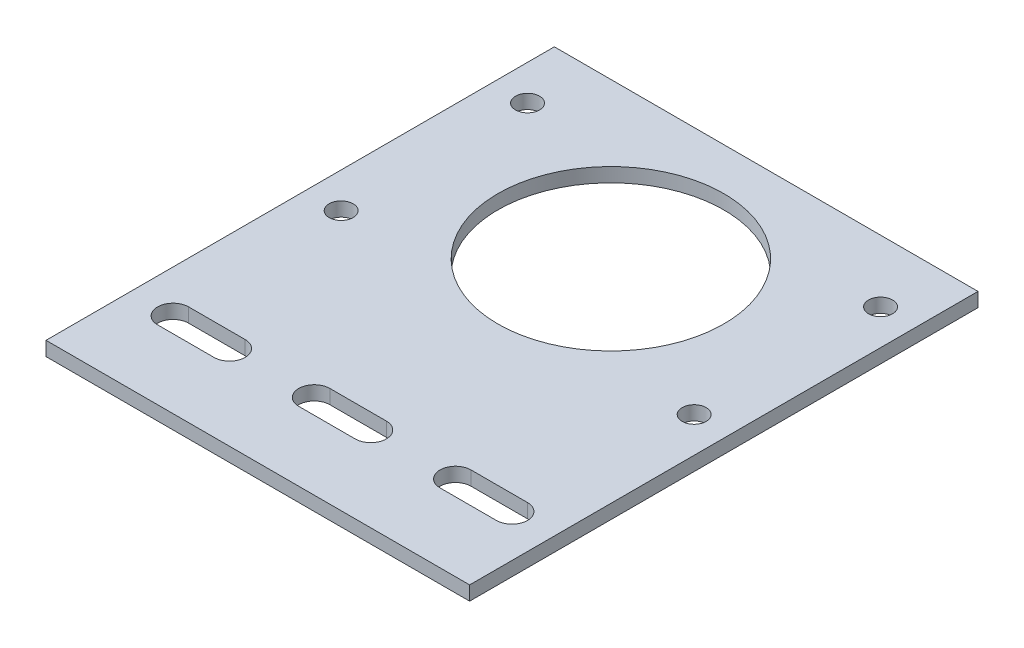
ISO-10303-21;
HEADER;
FILE_DESCRIPTION(('STEP AP214'),'2;1');
FILE_NAME('part.step','',(''),(''),'','','');
FILE_SCHEMA(('AUTOMOTIVE_DESIGN { 1 0 10303 214 1 1 1 1 }'));
ENDSEC;
DATA;
#1=APPLICATION_CONTEXT('core data for automotive mechanical design processes');
#2=APPLICATION_PROTOCOL_DEFINITION('international standard','automotive_design',2000,#1);
#3=PRODUCT_CONTEXT('',#1,'mechanical');
#4=PRODUCT('Part','Part','',(#3));
#5=PRODUCT_RELATED_PRODUCT_CATEGORY('part','',(#4));
#6=PRODUCT_DEFINITION_FORMATION('','',#4);
#7=PRODUCT_DEFINITION_CONTEXT('part definition',#1,'design');
#8=PRODUCT_DEFINITION('design','',#6,#7);
#9=PRODUCT_DEFINITION_SHAPE('','',#8);
#10=(LENGTH_UNIT() NAMED_UNIT(*) SI_UNIT(.MILLI.,.METRE.));
#11=(NAMED_UNIT(*) PLANE_ANGLE_UNIT() SI_UNIT($,.RADIAN.));
#12=(NAMED_UNIT(*) SI_UNIT($,.STERADIAN.) SOLID_ANGLE_UNIT());
#13=UNCERTAINTY_MEASURE_WITH_UNIT(LENGTH_MEASURE(1.E-05),#10,'distance_accuracy_value','');
#14=(GEOMETRIC_REPRESENTATION_CONTEXT(3) GLOBAL_UNCERTAINTY_ASSIGNED_CONTEXT((#13)) GLOBAL_UNIT_ASSIGNED_CONTEXT((#10,
#11,#12)) REPRESENTATION_CONTEXT('',''));
#15=CARTESIAN_POINT('',(0.,0.,0.));
#16=DIRECTION('',(0.,0.,1.));
#17=DIRECTION('',(1.,0.,0.));
#18=AXIS2_PLACEMENT_3D('',#15,#16,#17);
#19=CARTESIAN_POINT('',(0.,5.,0.));
#20=DIRECTION('',(0.,-1.,0.));
#21=DIRECTION('',(0.,0.,-1.));
#22=AXIS2_PLACEMENT_3D('',#19,#20,#21);
#23=PLANE('',#22);
#24=CARTESIAN_POINT('',(62.5,5.,-2.));
#25=DIRECTION('',(0.,1.,0.));
#26=DIRECTION('',(0.,0.,1.));
#27=AXIS2_PLACEMENT_3D('',#24,#25,#26);
#28=CIRCLE('',#27,4.25);
#29=CARTESIAN_POINT('',(62.5,5.,2.25));
#30=VERTEX_POINT('',#29);
#31=EDGE_CURVE('E20',#30,#30,#28,.F.);
#32=ORIENTED_EDGE('',*,*,#31,.T.);
#33=EDGE_LOOP('',(#32));
#34=FACE_BOUND('',#33,.T.);
#35=DIRECTION('',(1.,0.,0.));
#36=VECTOR('',#35,1.);
#37=CARTESIAN_POINT('',(-40.,5.,65.5));
#38=LINE('',#37,#36);
#39=CARTESIAN_POINT('',(-40.,5.,65.5));
#40=VERTEX_POINT('',#39);
#41=CARTESIAN_POINT('',(-60.,5.,65.5));
#42=VERTEX_POINT('',#41);
#43=EDGE_CURVE('E137',#40,#42,#38,.F.);
#44=ORIENTED_EDGE('',*,*,#43,.T.);
#45=CARTESIAN_POINT('',(-60.,5.,60.));
#46=DIRECTION('',(0.,1.,0.));
#47=DIRECTION('',(0.,0.,1.));
#48=AXIS2_PLACEMENT_3D('',#45,#46,#47);
#49=CIRCLE('',#48,5.5);
#50=CARTESIAN_POINT('',(-60.,5.,54.5));
#51=VERTEX_POINT('',#50);
#52=EDGE_CURVE('E195',#42,#51,#49,.F.);
#53=ORIENTED_EDGE('',*,*,#52,.T.);
#54=DIRECTION('',(-1.,0.,0.));
#55=VECTOR('',#54,1.);
#56=CARTESIAN_POINT('',(-40.,5.,54.5));
#57=LINE('',#56,#55);
#58=CARTESIAN_POINT('',(-40.,5.,54.5));
#59=VERTEX_POINT('',#58);
#60=EDGE_CURVE('E142',#51,#59,#57,.F.);
#61=ORIENTED_EDGE('',*,*,#60,.T.);
#62=CARTESIAN_POINT('',(-40.,5.,60.));
#63=DIRECTION('',(0.,1.,0.));
#64=DIRECTION('',(0.,0.,1.));
#65=AXIS2_PLACEMENT_3D('',#62,#63,#64);
#66=CIRCLE('',#65,5.5);
#67=EDGE_CURVE('E198',#59,#40,#66,.F.);
#68=ORIENTED_EDGE('',*,*,#67,.T.);
#69=EDGE_LOOP('',(#44,#53,#61,#68));
#70=FACE_BOUND('',#69,.T.);
#71=DIRECTION('',(1.,0.,0.));
#72=VECTOR('',#71,1.);
#73=CARTESIAN_POINT('',(-75.,5.,-90.));
#74=LINE('',#73,#72);
#75=CARTESIAN_POINT('',(75.,5.,-90.));
#76=VERTEX_POINT('',#75);
#77=CARTESIAN_POINT('',(-75.,5.,-90.));
#78=VERTEX_POINT('',#77);
#79=EDGE_CURVE('E490',#76,#78,#74,.F.);
#80=ORIENTED_EDGE('',*,*,#79,.T.);
#81=DIRECTION('',(0.,0.,-1.));
#82=VECTOR('',#81,1.);
#83=CARTESIAN_POINT('',(-75.,5.,90.));
#84=LINE('',#83,#82);
#85=CARTESIAN_POINT('',(-75.,5.,90.));
#86=VERTEX_POINT('',#85);
#87=EDGE_CURVE('E499',#78,#86,#84,.F.);
#88=ORIENTED_EDGE('',*,*,#87,.T.);
#89=DIRECTION('',(-1.,0.,0.));
#90=VECTOR('',#89,1.);
#91=CARTESIAN_POINT('',(-75.,5.,90.));
#92=LINE('',#91,#90);
#93=CARTESIAN_POINT('',(75.,5.,90.));
#94=VERTEX_POINT('',#93);
#95=EDGE_CURVE('E505',#86,#94,#92,.F.);
#96=ORIENTED_EDGE('',*,*,#95,.T.);
#97=DIRECTION('',(0.,0.,1.));
#98=VECTOR('',#97,1.);
#99=CARTESIAN_POINT('',(75.,5.,90.));
#100=LINE('',#99,#98);
#101=EDGE_CURVE('E150',#94,#76,#100,.F.);
#102=ORIENTED_EDGE('',*,*,#101,.T.);
#103=EDGE_LOOP('',(#80,#88,#96,#102));
#104=FACE_BOUND('',#103,.T.);
#105=CARTESIAN_POINT('',(60.,5.,60.));
#106=DIRECTION('',(0.,1.,0.));
#107=DIRECTION('',(0.,0.,1.));
#108=AXIS2_PLACEMENT_3D('',#105,#106,#107);
#109=CIRCLE('',#108,5.5);
#110=CARTESIAN_POINT('',(60.,5.,54.5));
#111=VERTEX_POINT('',#110);
#112=CARTESIAN_POINT('',(60.,5.,65.5));
#113=VERTEX_POINT('',#112);
#114=EDGE_CURVE('E158',#111,#113,#109,.F.);
#115=ORIENTED_EDGE('',*,*,#114,.T.);
#116=DIRECTION('',(1.,0.,0.));
#117=VECTOR('',#116,1.);
#118=CARTESIAN_POINT('',(60.,5.,65.5));
#119=LINE('',#118,#117);
#120=CARTESIAN_POINT('',(40.,5.,65.5));
#121=VERTEX_POINT('',#120);
#122=EDGE_CURVE('E147',#113,#121,#119,.F.);
#123=ORIENTED_EDGE('',*,*,#122,.T.);
#124=CARTESIAN_POINT('',(40.,5.,60.));
#125=DIRECTION('',(0.,1.,0.));
#126=DIRECTION('',(0.,0.,1.));
#127=AXIS2_PLACEMENT_3D('',#124,#125,#126);
#128=CIRCLE('',#127,5.5);
#129=CARTESIAN_POINT('',(40.,5.,54.5));
#130=VERTEX_POINT('',#129);
#131=EDGE_CURVE('E201',#121,#130,#128,.F.);
#132=ORIENTED_EDGE('',*,*,#131,.T.);
#133=DIRECTION('',(-1.,0.,0.));
#134=VECTOR('',#133,1.);
#135=CARTESIAN_POINT('',(60.,5.,54.5));
#136=LINE('',#135,#134);
#137=EDGE_CURVE('E152',#130,#111,#136,.F.);
#138=ORIENTED_EDGE('',*,*,#137,.T.);
#139=EDGE_LOOP('',(#115,#123,#132,#138));
#140=FACE_BOUND('',#139,.T.);
#141=CARTESIAN_POINT('',(10.,5.,60.));
#142=DIRECTION('',(0.,1.,0.));
#143=DIRECTION('',(0.,0.,1.));
#144=AXIS2_PLACEMENT_3D('',#141,#142,#143);
#145=CIRCLE('',#144,5.5);
#146=CARTESIAN_POINT('',(10.,5.,54.5));
#147=VERTEX_POINT('',#146);
#148=CARTESIAN_POINT('',(10.,5.,65.5));
#149=VERTEX_POINT('',#148);
#150=EDGE_CURVE('E108',#147,#149,#145,.F.);
#151=ORIENTED_EDGE('',*,*,#150,.T.);
#152=DIRECTION('',(1.,0.,0.));
#153=VECTOR('',#152,1.);
#154=CARTESIAN_POINT('',(10.,5.,65.5));
#155=LINE('',#154,#153);
#156=CARTESIAN_POINT('',(-10.,5.,65.5));
#157=VERTEX_POINT('',#156);
#158=EDGE_CURVE('E157',#149,#157,#155,.F.);
#159=ORIENTED_EDGE('',*,*,#158,.T.);
#160=CARTESIAN_POINT('',(-10.,5.,60.));
#161=DIRECTION('',(0.,1.,0.));
#162=DIRECTION('',(0.,0.,1.));
#163=AXIS2_PLACEMENT_3D('',#160,#161,#162);
#164=CIRCLE('',#163,5.5);
#165=CARTESIAN_POINT('',(-10.,5.,54.5));
#166=VERTEX_POINT('',#165);
#167=EDGE_CURVE('E124',#157,#166,#164,.F.);
#168=ORIENTED_EDGE('',*,*,#167,.T.);
#169=DIRECTION('',(-1.,0.,0.));
#170=VECTOR('',#169,1.);
#171=CARTESIAN_POINT('',(10.,5.,54.5));
#172=LINE('',#171,#170);
#173=EDGE_CURVE('E122',#166,#147,#172,.F.);
#174=ORIENTED_EDGE('',*,*,#173,.T.);
#175=EDGE_LOOP('',(#151,#159,#168,#174));
#176=FACE_BOUND('',#175,.T.);
#177=CARTESIAN_POINT('',(0.,5.,-35.));
#178=DIRECTION('',(0.,1.,0.));
#179=DIRECTION('',(0.,0.,1.));
#180=AXIS2_PLACEMENT_3D('',#177,#178,#179);
#181=CIRCLE('',#180,40.);
#182=CARTESIAN_POINT('',(0.,5.,5.));
#183=VERTEX_POINT('',#182);
#184=EDGE_CURVE('E119',#183,#183,#181,.F.);
#185=ORIENTED_EDGE('',*,*,#184,.T.);
#186=EDGE_LOOP('',(#185));
#187=FACE_BOUND('',#186,.T.);
#188=CARTESIAN_POINT('',(-62.5,5.,-68.));
#189=DIRECTION('',(0.,1.,0.));
#190=DIRECTION('',(0.,0.,1.));
#191=AXIS2_PLACEMENT_3D('',#188,#189,#190);
#192=CIRCLE('',#191,4.25);
#193=CARTESIAN_POINT('',(-62.5,5.,-63.75));
#194=VERTEX_POINT('',#193);
#195=EDGE_CURVE('E210',#194,#194,#192,.F.);
#196=ORIENTED_EDGE('',*,*,#195,.T.);
#197=EDGE_LOOP('',(#196));
#198=FACE_BOUND('',#197,.T.);
#199=CARTESIAN_POINT('',(-62.5,5.,-2.));
#200=DIRECTION('',(0.,1.,0.));
#201=DIRECTION('',(0.,0.,1.));
#202=AXIS2_PLACEMENT_3D('',#199,#200,#201);
#203=CIRCLE('',#202,4.25);
#204=CARTESIAN_POINT('',(-62.5,5.,2.25));
#205=VERTEX_POINT('',#204);
#206=EDGE_CURVE('E213',#205,#205,#203,.F.);
#207=ORIENTED_EDGE('',*,*,#206,.T.);
#208=EDGE_LOOP('',(#207));
#209=FACE_BOUND('',#208,.T.);
#210=CARTESIAN_POINT('',(62.5,5.,-68.));
#211=DIRECTION('',(0.,1.,0.));
#212=DIRECTION('',(0.,0.,1.));
#213=AXIS2_PLACEMENT_3D('',#210,#211,#212);
#214=CIRCLE('',#213,4.25);
#215=CARTESIAN_POINT('',(62.5,5.,-63.75));
#216=VERTEX_POINT('',#215);
#217=EDGE_CURVE('E215',#216,#216,#214,.F.);
#218=ORIENTED_EDGE('',*,*,#217,.T.);
#219=EDGE_LOOP('',(#218));
#220=FACE_BOUND('',#219,.T.);
#221=ADVANCED_FACE('F17',(#34,#70,#104,#140,#176,#187,#198,#209,#220),#23,.F.);
#222=CARTESIAN_POINT('',(62.5,5.,-2.));
#223=DIRECTION('',(0.,1.,0.));
#224=DIRECTION('',(0.,0.,1.));
#225=AXIS2_PLACEMENT_3D('',#222,#223,#224);
#226=CYLINDRICAL_SURFACE('',#225,4.25);
#227=CARTESIAN_POINT('',(62.5,0.,-2.));
#228=DIRECTION('',(0.,1.,0.));
#229=DIRECTION('',(0.,0.,1.));
#230=AXIS2_PLACEMENT_3D('',#227,#228,#229);
#231=CIRCLE('',#230,4.25);
#232=CARTESIAN_POINT('',(62.5,0.,2.25));
#233=VERTEX_POINT('',#232);
#234=EDGE_CURVE('E140',#233,#233,#231,.T.);
#235=ORIENTED_EDGE('',*,*,#234,.F.);
#236=EDGE_LOOP('',(#235));
#237=FACE_BOUND('',#236,.T.);
#238=ORIENTED_EDGE('',*,*,#31,.F.);
#239=EDGE_LOOP('',(#238));
#240=FACE_BOUND('',#239,.T.);
#241=ADVANCED_FACE('F224',(#237,#240),#226,.F.);
#242=CARTESIAN_POINT('',(62.5,5.,-68.));
#243=DIRECTION('',(0.,1.,0.));
#244=DIRECTION('',(0.,0.,1.));
#245=AXIS2_PLACEMENT_3D('',#242,#243,#244);
#246=CYLINDRICAL_SURFACE('',#245,4.25);
#247=CARTESIAN_POINT('',(62.5,0.,-68.));
#248=DIRECTION('',(0.,1.,0.));
#249=DIRECTION('',(0.,0.,1.));
#250=AXIS2_PLACEMENT_3D('',#247,#248,#249);
#251=CIRCLE('',#250,4.25);
#252=CARTESIAN_POINT('',(62.5,0.,-63.75));
#253=VERTEX_POINT('',#252);
#254=EDGE_CURVE('E190',#253,#253,#251,.T.);
#255=ORIENTED_EDGE('',*,*,#254,.F.);
#256=EDGE_LOOP('',(#255));
#257=FACE_BOUND('',#256,.T.);
#258=ORIENTED_EDGE('',*,*,#217,.F.);
#259=EDGE_LOOP('',(#258));
#260=FACE_BOUND('',#259,.T.);
#261=ADVANCED_FACE('F226',(#257,#260),#246,.F.);
#262=CARTESIAN_POINT('',(-62.5,5.,-2.));
#263=DIRECTION('',(0.,1.,0.));
#264=DIRECTION('',(0.,0.,1.));
#265=AXIS2_PLACEMENT_3D('',#262,#263,#264);
#266=CYLINDRICAL_SURFACE('',#265,4.25);
#267=CARTESIAN_POINT('',(-62.5,0.,-2.));
#268=DIRECTION('',(0.,1.,0.));
#269=DIRECTION('',(0.,0.,1.));
#270=AXIS2_PLACEMENT_3D('',#267,#268,#269);
#271=CIRCLE('',#270,4.25);
#272=CARTESIAN_POINT('',(-62.5,0.,2.25));
#273=VERTEX_POINT('',#272);
#274=EDGE_CURVE('E187',#273,#273,#271,.T.);
#275=ORIENTED_EDGE('',*,*,#274,.F.);
#276=EDGE_LOOP('',(#275));
#277=FACE_BOUND('',#276,.T.);
#278=ORIENTED_EDGE('',*,*,#206,.F.);
#279=EDGE_LOOP('',(#278));
#280=FACE_BOUND('',#279,.T.);
#281=ADVANCED_FACE('F234',(#277,#280),#266,.F.);
#282=CARTESIAN_POINT('',(-62.5,5.,-68.));
#283=DIRECTION('',(0.,1.,0.));
#284=DIRECTION('',(0.,0.,1.));
#285=AXIS2_PLACEMENT_3D('',#282,#283,#284);
#286=CYLINDRICAL_SURFACE('',#285,4.25);
#287=CARTESIAN_POINT('',(-62.5,0.,-68.));
#288=DIRECTION('',(0.,1.,0.));
#289=DIRECTION('',(0.,0.,1.));
#290=AXIS2_PLACEMENT_3D('',#287,#288,#289);
#291=CIRCLE('',#290,4.25);
#292=CARTESIAN_POINT('',(-62.5,0.,-63.75));
#293=VERTEX_POINT('',#292);
#294=EDGE_CURVE('E184',#293,#293,#291,.T.);
#295=ORIENTED_EDGE('',*,*,#294,.F.);
#296=EDGE_LOOP('',(#295));
#297=FACE_BOUND('',#296,.T.);
#298=ORIENTED_EDGE('',*,*,#195,.F.);
#299=EDGE_LOOP('',(#298));
#300=FACE_BOUND('',#299,.T.);
#301=ADVANCED_FACE('F309',(#297,#300),#286,.F.);
#302=CARTESIAN_POINT('',(0.,0.,-35.));
#303=DIRECTION('',(0.,1.,0.));
#304=DIRECTION('',(0.,0.,1.));
#305=AXIS2_PLACEMENT_3D('',#302,#303,#304);
#306=CYLINDRICAL_SURFACE('',#305,40.);
#307=ORIENTED_EDGE('',*,*,#184,.F.);
#308=EDGE_LOOP('',(#307));
#309=FACE_BOUND('',#308,.T.);
#310=CARTESIAN_POINT('',(0.,0.,-35.));
#311=DIRECTION('',(0.,1.,0.));
#312=DIRECTION('',(0.,0.,1.));
#313=AXIS2_PLACEMENT_3D('',#310,#311,#312);
#314=CIRCLE('',#313,40.);
#315=CARTESIAN_POINT('',(0.,0.,5.));
#316=VERTEX_POINT('',#315);
#317=EDGE_CURVE('E181',#316,#316,#314,.T.);
#318=ORIENTED_EDGE('',*,*,#317,.F.);
#319=EDGE_LOOP('',(#318));
#320=FACE_BOUND('',#319,.T.);
#321=ADVANCED_FACE('F306',(#309,#320),#306,.F.);
#322=CARTESIAN_POINT('',(10.,0.,60.));
#323=DIRECTION('',(0.,1.,0.));
#324=DIRECTION('',(0.,0.,1.));
#325=AXIS2_PLACEMENT_3D('',#322,#323,#324);
#326=CYLINDRICAL_SURFACE('',#325,5.5);
#327=DIRECTION('',(0.,1.,0.));
#328=VECTOR('',#327,1.);
#329=CARTESIAN_POINT('',(10.,0.,54.5));
#330=LINE('',#329,#328);
#331=CARTESIAN_POINT('',(10.,0.,54.5));
#332=VERTEX_POINT('',#331);
#333=EDGE_CURVE('E112',#147,#332,#330,.F.);
#334=ORIENTED_EDGE('',*,*,#333,.T.);
#335=CARTESIAN_POINT('',(10.,0.,60.));
#336=DIRECTION('',(0.,1.,0.));
#337=DIRECTION('',(0.,0.,1.));
#338=AXIS2_PLACEMENT_3D('',#335,#336,#337);
#339=CIRCLE('',#338,5.5);
#340=CARTESIAN_POINT('',(10.,0.,65.5));
#341=VERTEX_POINT('',#340);
#342=EDGE_CURVE('E179',#341,#332,#339,.T.);
#343=ORIENTED_EDGE('',*,*,#342,.F.);
#344=DIRECTION('',(0.,1.,0.));
#345=VECTOR('',#344,1.);
#346=CARTESIAN_POINT('',(10.,0.,65.5));
#347=LINE('',#346,#345);
#348=EDGE_CURVE('E115',#341,#149,#347,.T.);
#349=ORIENTED_EDGE('',*,*,#348,.T.);
#350=ORIENTED_EDGE('',*,*,#150,.F.);
#351=EDGE_LOOP('',(#334,#343,#349,#350));
#352=FACE_BOUND('',#351,.T.);
#353=ADVANCED_FACE('F110',(#352),#326,.F.);
#354=CARTESIAN_POINT('',(10.,0.,54.5));
#355=DIRECTION('',(0.,0.,-1.));
#356=DIRECTION('',(-1.,0.,0.));
#357=AXIS2_PLACEMENT_3D('',#354,#355,#356);
#358=PLANE('',#357);
#359=DIRECTION('',(0.,1.,0.));
#360=VECTOR('',#359,1.);
#361=CARTESIAN_POINT('',(-10.,0.,54.5));
#362=LINE('',#361,#360);
#363=CARTESIAN_POINT('',(-10.,0.,54.5));
#364=VERTEX_POINT('',#363);
#365=EDGE_CURVE('E127',#166,#364,#362,.F.);
#366=ORIENTED_EDGE('',*,*,#365,.T.);
#367=DIRECTION('',(1.,0.,0.));
#368=VECTOR('',#367,1.);
#369=CARTESIAN_POINT('',(0.,0.,54.5));
#370=LINE('',#369,#368);
#371=EDGE_CURVE('E131',#332,#364,#370,.F.);
#372=ORIENTED_EDGE('',*,*,#371,.F.);
#373=ORIENTED_EDGE('',*,*,#333,.F.);
#374=ORIENTED_EDGE('',*,*,#173,.F.);
#375=EDGE_LOOP('',(#366,#372,#373,#374));
#376=FACE_BOUND('',#375,.T.);
#377=ADVANCED_FACE('F129',(#376),#358,.F.);
#378=CARTESIAN_POINT('',(-10.,0.,60.));
#379=DIRECTION('',(0.,1.,0.));
#380=DIRECTION('',(0.,0.,1.));
#381=AXIS2_PLACEMENT_3D('',#378,#379,#380);
#382=CYLINDRICAL_SURFACE('',#381,5.5);
#383=DIRECTION('',(0.,1.,0.));
#384=VECTOR('',#383,1.);
#385=CARTESIAN_POINT('',(-10.,0.,65.5));
#386=LINE('',#385,#384);
#387=CARTESIAN_POINT('',(-10.,0.,65.5));
#388=VERTEX_POINT('',#387);
#389=EDGE_CURVE('E206',#157,#388,#386,.F.);
#390=ORIENTED_EDGE('',*,*,#389,.T.);
#391=CARTESIAN_POINT('',(-10.,0.,60.));
#392=DIRECTION('',(0.,1.,0.));
#393=DIRECTION('',(0.,0.,1.));
#394=AXIS2_PLACEMENT_3D('',#391,#392,#393);
#395=CIRCLE('',#394,5.5);
#396=EDGE_CURVE('E176',#364,#388,#395,.T.);
#397=ORIENTED_EDGE('',*,*,#396,.F.);
#398=ORIENTED_EDGE('',*,*,#365,.F.);
#399=ORIENTED_EDGE('',*,*,#167,.F.);
#400=EDGE_LOOP('',(#390,#397,#398,#399));
#401=FACE_BOUND('',#400,.T.);
#402=ADVANCED_FACE('F297',(#401),#382,.F.);
#403=CARTESIAN_POINT('',(10.,0.,65.5));
#404=DIRECTION('',(0.,0.,1.));
#405=DIRECTION('',(1.,0.,0.));
#406=AXIS2_PLACEMENT_3D('',#403,#404,#405);
#407=PLANE('',#406);
#408=ORIENTED_EDGE('',*,*,#348,.F.);
#409=DIRECTION('',(1.,0.,0.));
#410=VECTOR('',#409,1.);
#411=CARTESIAN_POINT('',(0.,0.,65.5));
#412=LINE('',#411,#410);
#413=EDGE_CURVE('E175',#388,#341,#412,.T.);
#414=ORIENTED_EDGE('',*,*,#413,.F.);
#415=ORIENTED_EDGE('',*,*,#389,.F.);
#416=ORIENTED_EDGE('',*,*,#158,.F.);
#417=EDGE_LOOP('',(#408,#414,#415,#416));
#418=FACE_BOUND('',#417,.T.);
#419=ADVANCED_FACE('F293',(#418),#407,.F.);
#420=CARTESIAN_POINT('',(60.,0.,60.));
#421=DIRECTION('',(0.,1.,0.));
#422=DIRECTION('',(0.,0.,1.));
#423=AXIS2_PLACEMENT_3D('',#420,#421,#422);
#424=CYLINDRICAL_SURFACE('',#423,5.5);
#425=DIRECTION('',(0.,1.,0.));
#426=VECTOR('',#425,1.);
#427=CARTESIAN_POINT('',(60.,0.,54.5));
#428=LINE('',#427,#426);
#429=CARTESIAN_POINT('',(60.,0.,54.5));
#430=VERTEX_POINT('',#429);
#431=EDGE_CURVE('E156',#111,#430,#428,.F.);
#432=ORIENTED_EDGE('',*,*,#431,.T.);
#433=CARTESIAN_POINT('',(60.,0.,60.));
#434=DIRECTION('',(0.,1.,0.));
#435=DIRECTION('',(0.,0.,1.));
#436=AXIS2_PLACEMENT_3D('',#433,#434,#435);
#437=CIRCLE('',#436,5.5);
#438=CARTESIAN_POINT('',(60.,0.,65.5));
#439=VERTEX_POINT('',#438);
#440=EDGE_CURVE('E172',#439,#430,#437,.T.);
#441=ORIENTED_EDGE('',*,*,#440,.F.);
#442=DIRECTION('',(0.,1.,0.));
#443=VECTOR('',#442,1.);
#444=CARTESIAN_POINT('',(60.,0.,65.5));
#445=LINE('',#444,#443);
#446=EDGE_CURVE('E151',#439,#113,#445,.T.);
#447=ORIENTED_EDGE('',*,*,#446,.T.);
#448=ORIENTED_EDGE('',*,*,#114,.F.);
#449=EDGE_LOOP('',(#432,#441,#447,#448));
#450=FACE_BOUND('',#449,.T.);
#451=ADVANCED_FACE('F289',(#450),#424,.F.);
#452=CARTESIAN_POINT('',(60.,0.,54.5));
#453=DIRECTION('',(0.,0.,-1.));
#454=DIRECTION('',(-1.,0.,0.));
#455=AXIS2_PLACEMENT_3D('',#452,#453,#454);
#456=PLANE('',#455);
#457=DIRECTION('',(0.,1.,0.));
#458=VECTOR('',#457,1.);
#459=CARTESIAN_POINT('',(40.,0.,54.5));
#460=LINE('',#459,#458);
#461=CARTESIAN_POINT('',(40.,0.,54.5));
#462=VERTEX_POINT('',#461);
#463=EDGE_CURVE('E155',#130,#462,#460,.F.);
#464=ORIENTED_EDGE('',*,*,#463,.T.);
#465=DIRECTION('',(1.,0.,0.));
#466=VECTOR('',#465,1.);
#467=CARTESIAN_POINT('',(0.,0.,54.5));
#468=LINE('',#467,#466);
#469=EDGE_CURVE('E171',#430,#462,#468,.F.);
#470=ORIENTED_EDGE('',*,*,#469,.F.);
#471=ORIENTED_EDGE('',*,*,#431,.F.);
#472=ORIENTED_EDGE('',*,*,#137,.F.);
#473=EDGE_LOOP('',(#464,#470,#471,#472));
#474=FACE_BOUND('',#473,.T.);
#475=ADVANCED_FACE('F285',(#474),#456,.F.);
#476=CARTESIAN_POINT('',(40.,0.,60.));
#477=DIRECTION('',(0.,1.,0.));
#478=DIRECTION('',(0.,0.,1.));
#479=AXIS2_PLACEMENT_3D('',#476,#477,#478);
#480=CYLINDRICAL_SURFACE('',#479,5.5);
#481=DIRECTION('',(0.,1.,0.));
#482=VECTOR('',#481,1.);
#483=CARTESIAN_POINT('',(40.,0.,65.5));
#484=LINE('',#483,#482);
#485=CARTESIAN_POINT('',(40.,0.,65.5));
#486=VERTEX_POINT('',#485);
#487=EDGE_CURVE('E204',#121,#486,#484,.F.);
#488=ORIENTED_EDGE('',*,*,#487,.T.);
#489=CARTESIAN_POINT('',(40.,0.,60.));
#490=DIRECTION('',(0.,1.,0.));
#491=DIRECTION('',(0.,0.,1.));
#492=AXIS2_PLACEMENT_3D('',#489,#490,#491);
#493=CIRCLE('',#492,5.5);
#494=EDGE_CURVE('E167',#462,#486,#493,.T.);
#495=ORIENTED_EDGE('',*,*,#494,.F.);
#496=ORIENTED_EDGE('',*,*,#463,.F.);
#497=ORIENTED_EDGE('',*,*,#131,.F.);
#498=EDGE_LOOP('',(#488,#495,#496,#497));
#499=FACE_BOUND('',#498,.T.);
#500=ADVANCED_FACE('F281',(#499),#480,.F.);
#501=CARTESIAN_POINT('',(60.,0.,65.5));
#502=DIRECTION('',(0.,0.,1.));
#503=DIRECTION('',(1.,0.,0.));
#504=AXIS2_PLACEMENT_3D('',#501,#502,#503);
#505=PLANE('',#504);
#506=ORIENTED_EDGE('',*,*,#446,.F.);
#507=DIRECTION('',(1.,0.,0.));
#508=VECTOR('',#507,1.);
#509=CARTESIAN_POINT('',(0.,0.,65.5));
#510=LINE('',#509,#508);
#511=EDGE_CURVE('E170',#486,#439,#510,.T.);
#512=ORIENTED_EDGE('',*,*,#511,.F.);
#513=ORIENTED_EDGE('',*,*,#487,.F.);
#514=ORIENTED_EDGE('',*,*,#122,.F.);
#515=EDGE_LOOP('',(#506,#512,#513,#514));
#516=FACE_BOUND('',#515,.T.);
#517=ADVANCED_FACE('F277',(#516),#505,.F.);
#518=CARTESIAN_POINT('',(75.,5.,90.));
#519=DIRECTION('',(-1.,0.,0.));
#520=DIRECTION('',(0.,0.,1.));
#521=AXIS2_PLACEMENT_3D('',#518,#519,#520);
#522=PLANE('',#521);
#523=DIRECTION('',(0.,1.,0.));
#524=VECTOR('',#523,1.);
#525=CARTESIAN_POINT('',(75.,5.,-90.));
#526=LINE('',#525,#524);
#527=CARTESIAN_POINT('',(75.,0.,-90.));
#528=VERTEX_POINT('',#527);
#529=EDGE_CURVE('E493',#528,#76,#526,.T.);
#530=ORIENTED_EDGE('',*,*,#529,.T.);
#531=ORIENTED_EDGE('',*,*,#101,.F.);
#532=DIRECTION('',(0.,1.,0.));
#533=VECTOR('',#532,1.);
#534=CARTESIAN_POINT('',(75.,5.,90.));
#535=LINE('',#534,#533);
#536=CARTESIAN_POINT('',(75.,0.,90.));
#537=VERTEX_POINT('',#536);
#538=EDGE_CURVE('E502',#94,#537,#535,.F.);
#539=ORIENTED_EDGE('',*,*,#538,.T.);
#540=DIRECTION('',(0.,0.,-1.));
#541=VECTOR('',#540,1.);
#542=CARTESIAN_POINT('',(75.,0.,0.));
#543=LINE('',#542,#541);
#544=EDGE_CURVE('E524',#528,#537,#543,.F.);
#545=ORIENTED_EDGE('',*,*,#544,.F.);
#546=EDGE_LOOP('',(#530,#531,#539,#545));
#547=FACE_BOUND('',#546,.T.);
#548=ADVANCED_FACE('F273',(#547),#522,.F.);
#549=CARTESIAN_POINT('',(-75.,5.,90.));
#550=DIRECTION('',(0.,0.,-1.));
#551=DIRECTION('',(-1.,0.,0.));
#552=AXIS2_PLACEMENT_3D('',#549,#550,#551);
#553=PLANE('',#552);
#554=ORIENTED_EDGE('',*,*,#538,.F.);
#555=ORIENTED_EDGE('',*,*,#95,.F.);
#556=DIRECTION('',(0.,1.,0.));
#557=VECTOR('',#556,1.);
#558=CARTESIAN_POINT('',(-75.,5.,90.));
#559=LINE('',#558,#557);
#560=CARTESIAN_POINT('',(-75.,0.,90.));
#561=VERTEX_POINT('',#560);
#562=EDGE_CURVE('E496',#86,#561,#559,.F.);
#563=ORIENTED_EDGE('',*,*,#562,.T.);
#564=DIRECTION('',(1.,0.,0.));
#565=VECTOR('',#564,1.);
#566=CARTESIAN_POINT('',(0.,0.,90.));
#567=LINE('',#566,#565);
#568=EDGE_CURVE('E527',#537,#561,#567,.F.);
#569=ORIENTED_EDGE('',*,*,#568,.F.);
#570=EDGE_LOOP('',(#554,#555,#563,#569));
#571=FACE_BOUND('',#570,.T.);
#572=ADVANCED_FACE('F269',(#571),#553,.F.);
#573=CARTESIAN_POINT('',(-75.,5.,90.));
#574=DIRECTION('',(1.,0.,0.));
#575=DIRECTION('',(0.,0.,-1.));
#576=AXIS2_PLACEMENT_3D('',#573,#574,#575);
#577=PLANE('',#576);
#578=ORIENTED_EDGE('',*,*,#562,.F.);
#579=ORIENTED_EDGE('',*,*,#87,.F.);
#580=DIRECTION('',(0.,1.,0.));
#581=VECTOR('',#580,1.);
#582=CARTESIAN_POINT('',(-75.,5.,-90.));
#583=LINE('',#582,#581);
#584=CARTESIAN_POINT('',(-75.,0.,-90.));
#585=VERTEX_POINT('',#584);
#586=EDGE_CURVE('E200',#78,#585,#583,.F.);
#587=ORIENTED_EDGE('',*,*,#586,.T.);
#588=DIRECTION('',(0.,0.,-1.));
#589=VECTOR('',#588,1.);
#590=CARTESIAN_POINT('',(-75.,0.,0.));
#591=LINE('',#590,#589);
#592=EDGE_CURVE('E532',#561,#585,#591,.T.);
#593=ORIENTED_EDGE('',*,*,#592,.F.);
#594=EDGE_LOOP('',(#578,#579,#587,#593));
#595=FACE_BOUND('',#594,.T.);
#596=ADVANCED_FACE('F265',(#595),#577,.F.);
#597=CARTESIAN_POINT('',(-75.,5.,-90.));
#598=DIRECTION('',(0.,0.,1.));
#599=DIRECTION('',(1.,0.,0.));
#600=AXIS2_PLACEMENT_3D('',#597,#598,#599);
#601=PLANE('',#600);
#602=ORIENTED_EDGE('',*,*,#586,.F.);
#603=ORIENTED_EDGE('',*,*,#79,.F.);
#604=ORIENTED_EDGE('',*,*,#529,.F.);
#605=DIRECTION('',(1.,0.,0.));
#606=VECTOR('',#605,1.);
#607=CARTESIAN_POINT('',(0.,0.,-90.));
#608=LINE('',#607,#606);
#609=EDGE_CURVE('E166',#585,#528,#608,.T.);
#610=ORIENTED_EDGE('',*,*,#609,.F.);
#611=EDGE_LOOP('',(#602,#603,#604,#610));
#612=FACE_BOUND('',#611,.T.);
#613=ADVANCED_FACE('F261',(#612),#601,.F.);
#614=CARTESIAN_POINT('',(-40.,0.,60.));
#615=DIRECTION('',(0.,1.,0.));
#616=DIRECTION('',(0.,0.,1.));
#617=AXIS2_PLACEMENT_3D('',#614,#615,#616);
#618=CYLINDRICAL_SURFACE('',#617,5.5);
#619=DIRECTION('',(0.,1.,0.));
#620=VECTOR('',#619,1.);
#621=CARTESIAN_POINT('',(-40.,0.,54.5));
#622=LINE('',#621,#620);
#623=CARTESIAN_POINT('',(-40.,0.,54.5));
#624=VERTEX_POINT('',#623);
#625=EDGE_CURVE('E146',#59,#624,#622,.F.);
#626=ORIENTED_EDGE('',*,*,#625,.T.);
#627=CARTESIAN_POINT('',(-40.,0.,60.));
#628=DIRECTION('',(0.,1.,0.));
#629=DIRECTION('',(0.,0.,1.));
#630=AXIS2_PLACEMENT_3D('',#627,#628,#629);
#631=CIRCLE('',#630,5.5);
#632=CARTESIAN_POINT('',(-40.,0.,65.5));
#633=VERTEX_POINT('',#632);
#634=EDGE_CURVE('E163',#633,#624,#631,.T.);
#635=ORIENTED_EDGE('',*,*,#634,.F.);
#636=DIRECTION('',(0.,1.,0.));
#637=VECTOR('',#636,1.);
#638=CARTESIAN_POINT('',(-40.,0.,65.5));
#639=LINE('',#638,#637);
#640=EDGE_CURVE('E141',#633,#40,#639,.T.);
#641=ORIENTED_EDGE('',*,*,#640,.T.);
#642=ORIENTED_EDGE('',*,*,#67,.F.);
#643=EDGE_LOOP('',(#626,#635,#641,#642));
#644=FACE_BOUND('',#643,.T.);
#645=ADVANCED_FACE('F257',(#644),#618,.F.);
#646=CARTESIAN_POINT('',(-40.,0.,54.5));
#647=DIRECTION('',(0.,0.,-1.));
#648=DIRECTION('',(-1.,0.,0.));
#649=AXIS2_PLACEMENT_3D('',#646,#647,#648);
#650=PLANE('',#649);
#651=DIRECTION('',(0.,1.,0.));
#652=VECTOR('',#651,1.);
#653=CARTESIAN_POINT('',(-60.,0.,54.5));
#654=LINE('',#653,#652);
#655=CARTESIAN_POINT('',(-60.,0.,54.5));
#656=VERTEX_POINT('',#655);
#657=EDGE_CURVE('E145',#51,#656,#654,.F.);
#658=ORIENTED_EDGE('',*,*,#657,.T.);
#659=DIRECTION('',(1.,0.,0.));
#660=VECTOR('',#659,1.);
#661=CARTESIAN_POINT('',(0.,0.,54.5));
#662=LINE('',#661,#660);
#663=EDGE_CURVE('E162',#624,#656,#662,.F.);
#664=ORIENTED_EDGE('',*,*,#663,.F.);
#665=ORIENTED_EDGE('',*,*,#625,.F.);
#666=ORIENTED_EDGE('',*,*,#60,.F.);
#667=EDGE_LOOP('',(#658,#664,#665,#666));
#668=FACE_BOUND('',#667,.T.);
#669=ADVANCED_FACE('F254',(#668),#650,.F.);
#670=CARTESIAN_POINT('',(-60.,0.,60.));
#671=DIRECTION('',(0.,1.,0.));
#672=DIRECTION('',(0.,0.,1.));
#673=AXIS2_PLACEMENT_3D('',#670,#671,#672);
#674=CYLINDRICAL_SURFACE('',#673,5.5);
#675=DIRECTION('',(0.,1.,0.));
#676=VECTOR('',#675,1.);
#677=CARTESIAN_POINT('',(-60.,0.,65.5));
#678=LINE('',#677,#676);
#679=CARTESIAN_POINT('',(-60.,0.,65.5));
#680=VERTEX_POINT('',#679);
#681=EDGE_CURVE('E35',#42,#680,#678,.F.);
#682=ORIENTED_EDGE('',*,*,#681,.T.);
#683=CARTESIAN_POINT('',(-60.,0.,60.));
#684=DIRECTION('',(0.,1.,0.));
#685=DIRECTION('',(0.,0.,1.));
#686=AXIS2_PLACEMENT_3D('',#683,#684,#685);
#687=CIRCLE('',#686,5.5);
#688=EDGE_CURVE('E26',#656,#680,#687,.T.);
#689=ORIENTED_EDGE('',*,*,#688,.F.);
#690=ORIENTED_EDGE('',*,*,#657,.F.);
#691=ORIENTED_EDGE('',*,*,#52,.F.);
#692=EDGE_LOOP('',(#682,#689,#690,#691));
#693=FACE_BOUND('',#692,.T.);
#694=ADVANCED_FACE('F247',(#693),#674,.F.);
#695=CARTESIAN_POINT('',(-40.,0.,65.5));
#696=DIRECTION('',(0.,0.,1.));
#697=DIRECTION('',(1.,0.,0.));
#698=AXIS2_PLACEMENT_3D('',#695,#696,#697);
#699=PLANE('',#698);
#700=ORIENTED_EDGE('',*,*,#640,.F.);
#701=DIRECTION('',(1.,0.,0.));
#702=VECTOR('',#701,1.);
#703=CARTESIAN_POINT('',(0.,0.,65.5));
#704=LINE('',#703,#702);
#705=EDGE_CURVE('E11',#680,#633,#704,.T.);
#706=ORIENTED_EDGE('',*,*,#705,.F.);
#707=ORIENTED_EDGE('',*,*,#681,.F.);
#708=ORIENTED_EDGE('',*,*,#43,.F.);
#709=EDGE_LOOP('',(#700,#706,#707,#708));
#710=FACE_BOUND('',#709,.T.);
#711=ADVANCED_FACE('F240',(#710),#699,.F.);
#712=CARTESIAN_POINT('',(0.,0.,0.));
#713=DIRECTION('',(0.,-1.,0.));
#714=DIRECTION('',(0.,0.,-1.));
#715=AXIS2_PLACEMENT_3D('',#712,#713,#714);
#716=PLANE('',#715);
#717=ORIENTED_EDGE('',*,*,#688,.T.);
#718=ORIENTED_EDGE('',*,*,#705,.T.);
#719=ORIENTED_EDGE('',*,*,#634,.T.);
#720=ORIENTED_EDGE('',*,*,#663,.T.);
#721=EDGE_LOOP('',(#717,#718,#719,#720));
#722=FACE_BOUND('',#721,.T.);
#723=ORIENTED_EDGE('',*,*,#592,.T.);
#724=ORIENTED_EDGE('',*,*,#609,.T.);
#725=ORIENTED_EDGE('',*,*,#544,.T.);
#726=ORIENTED_EDGE('',*,*,#568,.T.);
#727=EDGE_LOOP('',(#723,#724,#725,#726));
#728=FACE_BOUND('',#727,.T.);
#729=ORIENTED_EDGE('',*,*,#494,.T.);
#730=ORIENTED_EDGE('',*,*,#511,.T.);
#731=ORIENTED_EDGE('',*,*,#440,.T.);
#732=ORIENTED_EDGE('',*,*,#469,.T.);
#733=EDGE_LOOP('',(#729,#730,#731,#732));
#734=FACE_BOUND('',#733,.T.);
#735=ORIENTED_EDGE('',*,*,#396,.T.);
#736=ORIENTED_EDGE('',*,*,#413,.T.);
#737=ORIENTED_EDGE('',*,*,#342,.T.);
#738=ORIENTED_EDGE('',*,*,#371,.T.);
#739=EDGE_LOOP('',(#735,#736,#737,#738));
#740=FACE_BOUND('',#739,.T.);
#741=ORIENTED_EDGE('',*,*,#317,.T.);
#742=EDGE_LOOP('',(#741));
#743=FACE_BOUND('',#742,.T.);
#744=ORIENTED_EDGE('',*,*,#294,.T.);
#745=EDGE_LOOP('',(#744));
#746=FACE_BOUND('',#745,.T.);
#747=ORIENTED_EDGE('',*,*,#274,.T.);
#748=EDGE_LOOP('',(#747));
#749=FACE_BOUND('',#748,.T.);
#750=ORIENTED_EDGE('',*,*,#254,.T.);
#751=EDGE_LOOP('',(#750));
#752=FACE_BOUND('',#751,.T.);
#753=ORIENTED_EDGE('',*,*,#234,.T.);
#754=EDGE_LOOP('',(#753));
#755=FACE_BOUND('',#754,.T.);
#756=ADVANCED_FACE('F238',(#722,#728,#734,#740,#743,#746,#749,#752,#755),#716,.T.);
#757=CLOSED_SHELL('',(#221,#241,#261,#281,#301,#321,#353,#377,#402,#419,#451,#475,#500,#517,
#548,#572,#596,#613,#645,#669,#694,#711,#756));
#758=MANIFOLD_SOLID_BREP('B1',#757);
#759=ADVANCED_BREP_SHAPE_REPRESENTATION('',(#18,#758),#14);
#760=SHAPE_DEFINITION_REPRESENTATION(#9,#759);
ENDSEC;
END-ISO-10303-21;
